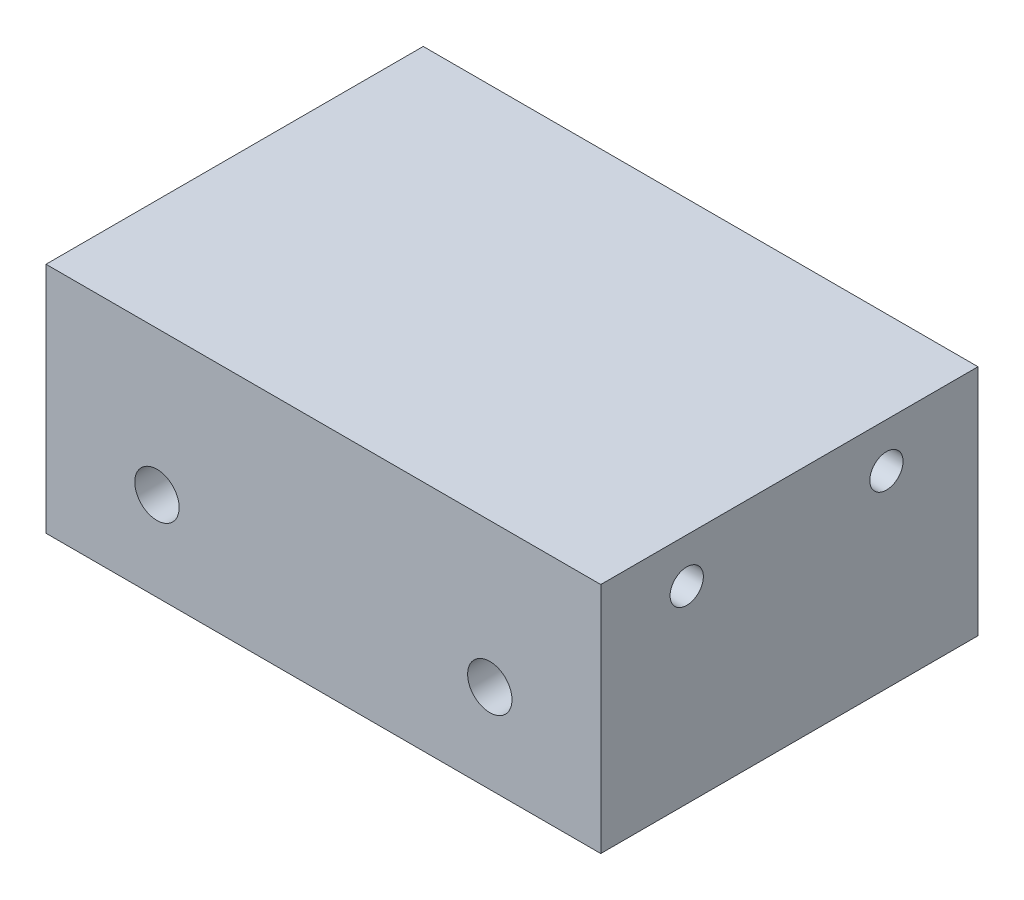
ISO-10303-21;
HEADER;
FILE_DESCRIPTION(('STEP AP214'),'2;1');
FILE_NAME('part.step','',(''),(''),'','','');
FILE_SCHEMA(('AUTOMOTIVE_DESIGN { 1 0 10303 214 1 1 1 1 }'));
ENDSEC;
DATA;
#1=APPLICATION_CONTEXT('core data for automotive mechanical design processes');
#2=APPLICATION_PROTOCOL_DEFINITION('international standard','automotive_design',2000,#1);
#3=PRODUCT_CONTEXT('',#1,'mechanical');
#4=PRODUCT('Part','Part','',(#3));
#5=PRODUCT_RELATED_PRODUCT_CATEGORY('part','',(#4));
#6=PRODUCT_DEFINITION_FORMATION('','',#4);
#7=PRODUCT_DEFINITION_CONTEXT('part definition',#1,'design');
#8=PRODUCT_DEFINITION('design','',#6,#7);
#9=PRODUCT_DEFINITION_SHAPE('','',#8);
#10=(LENGTH_UNIT() NAMED_UNIT(*) SI_UNIT(.MILLI.,.METRE.));
#11=(NAMED_UNIT(*) PLANE_ANGLE_UNIT() SI_UNIT($,.RADIAN.));
#12=(NAMED_UNIT(*) SI_UNIT($,.STERADIAN.) SOLID_ANGLE_UNIT());
#13=UNCERTAINTY_MEASURE_WITH_UNIT(LENGTH_MEASURE(1.E-05),#10,'distance_accuracy_value','');
#14=(GEOMETRIC_REPRESENTATION_CONTEXT(3) GLOBAL_UNCERTAINTY_ASSIGNED_CONTEXT((#13)) GLOBAL_UNIT_ASSIGNED_CONTEXT((#10,
#11,#12)) REPRESENTATION_CONTEXT('',''));
#15=CARTESIAN_POINT('',(0.,0.,0.));
#16=DIRECTION('',(0.,0.,1.));
#17=DIRECTION('',(1.,0.,0.));
#18=AXIS2_PLACEMENT_3D('',#15,#16,#17);
#19=CARTESIAN_POINT('',(-25.,-24.,88.230987451825));
#20=DIRECTION('',(-1.,0.,0.));
#21=DIRECTION('',(0.,-1.,0.));
#22=AXIS2_PLACEMENT_3D('',#19,#20,#21);
#23=PLANE('',#22);
#24=CARTESIAN_POINT('',(-25.,-7.,26.2525539123196));
#25=DIRECTION('',(-1.,0.,0.));
#26=DIRECTION('',(0.,-1.,0.));
#27=AXIS2_PLACEMENT_3D('',#24,#25,#26);
#28=CIRCLE('',#27,1.5);
#29=CARTESIAN_POINT('',(-25.,-8.5,26.2525539123196));
#30=VERTEX_POINT('',#29);
#31=EDGE_CURVE('E130',#30,#30,#28,.T.);
#32=ORIENTED_EDGE('',*,*,#31,.F.);
#33=EDGE_LOOP('',(#32));
#34=FACE_BOUND('',#33,.T.);
#35=CARTESIAN_POINT('',(-25.,-7.,8.25255391231962));
#36=DIRECTION('',(-1.,0.,0.));
#37=DIRECTION('',(0.,-1.,0.));
#38=AXIS2_PLACEMENT_3D('',#35,#36,#37);
#39=CIRCLE('',#38,1.5);
#40=CARTESIAN_POINT('',(-25.,-8.5,8.25255391231962));
#41=VERTEX_POINT('',#40);
#42=EDGE_CURVE('E124',#41,#41,#39,.T.);
#43=ORIENTED_EDGE('',*,*,#42,.F.);
#44=EDGE_LOOP('',(#43));
#45=FACE_BOUND('',#44,.T.);
#46=DIRECTION('',(0.,0.,-1.));
#47=VECTOR('',#46,1.);
#48=CARTESIAN_POINT('',(-25.,-24.,88.230987451825));
#49=LINE('',#48,#47);
#50=CARTESIAN_POINT('',(-25.,-24.,34.));
#51=VERTEX_POINT('',#50);
#52=CARTESIAN_POINT('',(-25.,-24.,0.));
#53=VERTEX_POINT('',#52);
#54=EDGE_CURVE('E92',#51,#53,#49,.T.);
#55=ORIENTED_EDGE('',*,*,#54,.F.);
#56=DIRECTION('',(0.,1.,0.));
#57=VECTOR('',#56,1.);
#58=CARTESIAN_POINT('',(-25.,-24.,34.));
#59=LINE('',#58,#57);
#60=CARTESIAN_POINT('',(-25.,-3.,34.));
#61=VERTEX_POINT('',#60);
#62=EDGE_CURVE('E106',#51,#61,#59,.T.);
#63=ORIENTED_EDGE('',*,*,#62,.T.);
#64=DIRECTION('',(0.,0.,-1.));
#65=VECTOR('',#64,1.);
#66=CARTESIAN_POINT('',(-25.,-3.,88.230987451825));
#67=LINE('',#66,#65);
#68=CARTESIAN_POINT('',(-25.,-3.,0.));
#69=VERTEX_POINT('',#68);
#70=EDGE_CURVE('E39',#61,#69,#67,.T.);
#71=ORIENTED_EDGE('',*,*,#70,.T.);
#72=DIRECTION('',(0.,1.,0.));
#73=VECTOR('',#72,1.);
#74=CARTESIAN_POINT('',(-25.,-24.,0.));
#75=LINE('',#74,#73);
#76=EDGE_CURVE('E102',#53,#69,#75,.T.);
#77=ORIENTED_EDGE('',*,*,#76,.F.);
#78=EDGE_LOOP('',(#55,#63,#71,#77));
#79=FACE_BOUND('',#78,.T.);
#80=ADVANCED_FACE('F35',(#34,#45,#79),#23,.T.);
#81=CARTESIAN_POINT('',(-25.,-24.,88.230987451825));
#82=DIRECTION('',(0.,1.,0.));
#83=DIRECTION('',(0.,0.,1.));
#84=AXIS2_PLACEMENT_3D('',#81,#82,#83);
#85=PLANE('',#84);
#86=DIRECTION('',(1.,0.,0.));
#87=VECTOR('',#86,1.);
#88=CARTESIAN_POINT('',(-25.,-24.,34.));
#89=LINE('',#88,#87);
#90=CARTESIAN_POINT('',(25.,-24.,34.));
#91=VERTEX_POINT('',#90);
#92=EDGE_CURVE('E74',#51,#91,#89,.T.);
#93=ORIENTED_EDGE('',*,*,#92,.F.);
#94=ORIENTED_EDGE('',*,*,#54,.T.);
#95=DIRECTION('',(1.,0.,0.));
#96=VECTOR('',#95,1.);
#97=CARTESIAN_POINT('',(-25.,-24.,0.));
#98=LINE('',#97,#96);
#99=CARTESIAN_POINT('',(25.,-24.,0.));
#100=VERTEX_POINT('',#99);
#101=EDGE_CURVE('E88',#53,#100,#98,.T.);
#102=ORIENTED_EDGE('',*,*,#101,.T.);
#103=DIRECTION('',(0.,0.,-1.));
#104=VECTOR('',#103,1.);
#105=CARTESIAN_POINT('',(25.,-24.,88.230987451825));
#106=LINE('',#105,#104);
#107=EDGE_CURVE('E82',#91,#100,#106,.T.);
#108=ORIENTED_EDGE('',*,*,#107,.F.);
#109=EDGE_LOOP('',(#93,#94,#102,#108));
#110=FACE_BOUND('',#109,.T.);
#111=ADVANCED_FACE('F91',(#110),#85,.F.);
#112=CARTESIAN_POINT('',(25.,-24.,88.230987451825));
#113=DIRECTION('',(-1.,0.,0.));
#114=DIRECTION('',(0.,-1.,0.));
#115=AXIS2_PLACEMENT_3D('',#112,#113,#114);
#116=PLANE('',#115);
#117=CARTESIAN_POINT('',(25.,-6.99999999999999,26.2525539123196));
#118=DIRECTION('',(-1.,0.,0.));
#119=DIRECTION('',(0.,-1.,0.));
#120=AXIS2_PLACEMENT_3D('',#117,#118,#119);
#121=CIRCLE('',#120,1.5);
#122=CARTESIAN_POINT('',(25.,-8.49999999999999,26.2525539123196));
#123=VERTEX_POINT('',#122);
#124=EDGE_CURVE('E127',#123,#123,#121,.T.);
#125=ORIENTED_EDGE('',*,*,#124,.T.);
#126=EDGE_LOOP('',(#125));
#127=FACE_BOUND('',#126,.T.);
#128=CARTESIAN_POINT('',(25.,-6.99999999999998,8.25255391231962));
#129=DIRECTION('',(-1.,0.,0.));
#130=DIRECTION('',(0.,-1.,0.));
#131=AXIS2_PLACEMENT_3D('',#128,#129,#130);
#132=CIRCLE('',#131,1.5);
#133=CARTESIAN_POINT('',(25.,-8.49999999999998,8.25255391231962));
#134=VERTEX_POINT('',#133);
#135=EDGE_CURVE('E121',#134,#134,#132,.T.);
#136=ORIENTED_EDGE('',*,*,#135,.T.);
#137=EDGE_LOOP('',(#136));
#138=FACE_BOUND('',#137,.T.);
#139=DIRECTION('',(0.,1.,0.));
#140=VECTOR('',#139,1.);
#141=CARTESIAN_POINT('',(25.,-24.,34.));
#142=LINE('',#141,#140);
#143=CARTESIAN_POINT('',(25.,-3.,34.));
#144=VERTEX_POINT('',#143);
#145=EDGE_CURVE('E44',#91,#144,#142,.T.);
#146=ORIENTED_EDGE('',*,*,#145,.F.);
#147=ORIENTED_EDGE('',*,*,#107,.T.);
#148=DIRECTION('',(0.,1.,0.));
#149=VECTOR('',#148,1.);
#150=CARTESIAN_POINT('',(25.,-24.,0.));
#151=LINE('',#150,#149);
#152=CARTESIAN_POINT('',(25.,-3.,0.));
#153=VERTEX_POINT('',#152);
#154=EDGE_CURVE('E86',#100,#153,#151,.T.);
#155=ORIENTED_EDGE('',*,*,#154,.T.);
#156=DIRECTION('',(0.,0.,-1.));
#157=VECTOR('',#156,1.);
#158=CARTESIAN_POINT('',(25.,-3.,88.230987451825));
#159=LINE('',#158,#157);
#160=EDGE_CURVE('E57',#144,#153,#159,.T.);
#161=ORIENTED_EDGE('',*,*,#160,.F.);
#162=EDGE_LOOP('',(#146,#147,#155,#161));
#163=FACE_BOUND('',#162,.T.);
#164=ADVANCED_FACE('F84',(#127,#138,#163),#116,.F.);
#165=CARTESIAN_POINT('',(25.,-3.,88.230987451825));
#166=DIRECTION('',(0.,-1.,0.));
#167=DIRECTION('',(0.,0.,-1.));
#168=AXIS2_PLACEMENT_3D('',#165,#166,#167);
#169=PLANE('',#168);
#170=DIRECTION('',(-1.,0.,0.));
#171=VECTOR('',#170,1.);
#172=CARTESIAN_POINT('',(25.,-3.,34.));
#173=LINE('',#172,#171);
#174=EDGE_CURVE('E11',#144,#61,#173,.T.);
#175=ORIENTED_EDGE('',*,*,#174,.F.);
#176=ORIENTED_EDGE('',*,*,#160,.T.);
#177=DIRECTION('',(-1.,0.,0.));
#178=VECTOR('',#177,1.);
#179=CARTESIAN_POINT('',(25.,-3.,0.));
#180=LINE('',#179,#178);
#181=EDGE_CURVE('E97',#153,#69,#180,.T.);
#182=ORIENTED_EDGE('',*,*,#181,.T.);
#183=ORIENTED_EDGE('',*,*,#70,.F.);
#184=EDGE_LOOP('',(#175,#176,#182,#183));
#185=FACE_BOUND('',#184,.T.);
#186=ADVANCED_FACE('F149',(#185),#169,.F.);
#187=CARTESIAN_POINT('',(0.,0.,0.));
#188=DIRECTION('',(0.,0.,1.));
#189=DIRECTION('',(1.,0.,0.));
#190=AXIS2_PLACEMENT_3D('',#187,#188,#189);
#191=PLANE('',#190);
#192=CARTESIAN_POINT('',(-15.,-16.,0.));
#193=DIRECTION('',(0.,0.,-1.));
#194=DIRECTION('',(-1.,0.,0.));
#195=AXIS2_PLACEMENT_3D('',#192,#193,#194);
#196=CIRCLE('',#195,2.00000000000001);
#197=CARTESIAN_POINT('',(-17.,-16.,0.));
#198=VERTEX_POINT('',#197);
#199=EDGE_CURVE('E118',#198,#198,#196,.T.);
#200=ORIENTED_EDGE('',*,*,#199,.F.);
#201=EDGE_LOOP('',(#200));
#202=FACE_BOUND('',#201,.T.);
#203=CARTESIAN_POINT('',(15.,-16.,0.));
#204=DIRECTION('',(0.,0.,-1.));
#205=DIRECTION('',(-1.,0.,0.));
#206=AXIS2_PLACEMENT_3D('',#203,#204,#205);
#207=CIRCLE('',#206,2.00000000000002);
#208=CARTESIAN_POINT('',(13.,-16.,0.));
#209=VERTEX_POINT('',#208);
#210=EDGE_CURVE('E111',#209,#209,#207,.T.);
#211=ORIENTED_EDGE('',*,*,#210,.F.);
#212=EDGE_LOOP('',(#211));
#213=FACE_BOUND('',#212,.T.);
#214=ORIENTED_EDGE('',*,*,#76,.T.);
#215=ORIENTED_EDGE('',*,*,#181,.F.);
#216=ORIENTED_EDGE('',*,*,#154,.F.);
#217=ORIENTED_EDGE('',*,*,#101,.F.);
#218=EDGE_LOOP('',(#214,#215,#216,#217));
#219=FACE_BOUND('',#218,.T.);
#220=ADVANCED_FACE('F96',(#202,#213,#219),#191,.F.);
#221=CARTESIAN_POINT('',(-25.,-24.,34.));
#222=DIRECTION('',(0.,0.,1.));
#223=DIRECTION('',(0.,-1.,0.));
#224=AXIS2_PLACEMENT_3D('',#221,#222,#223);
#225=PLANE('',#224);
#226=CARTESIAN_POINT('',(-15.,-16.,34.));
#227=DIRECTION('',(0.,0.,-1.));
#228=DIRECTION('',(-1.,0.,0.));
#229=AXIS2_PLACEMENT_3D('',#226,#227,#228);
#230=CIRCLE('',#229,2.00000000000001);
#231=CARTESIAN_POINT('',(-17.,-16.,34.));
#232=VERTEX_POINT('',#231);
#233=EDGE_CURVE('E116',#232,#232,#230,.T.);
#234=ORIENTED_EDGE('',*,*,#233,.T.);
#235=EDGE_LOOP('',(#234));
#236=FACE_BOUND('',#235,.T.);
#237=CARTESIAN_POINT('',(15.,-16.,34.));
#238=DIRECTION('',(0.,0.,-1.));
#239=DIRECTION('',(-1.,0.,0.));
#240=AXIS2_PLACEMENT_3D('',#237,#238,#239);
#241=CIRCLE('',#240,2.00000000000002);
#242=CARTESIAN_POINT('',(13.,-16.,34.));
#243=VERTEX_POINT('',#242);
#244=EDGE_CURVE('E107',#243,#243,#241,.T.);
#245=ORIENTED_EDGE('',*,*,#244,.T.);
#246=EDGE_LOOP('',(#245));
#247=FACE_BOUND('',#246,.T.);
#248=ORIENTED_EDGE('',*,*,#62,.F.);
#249=ORIENTED_EDGE('',*,*,#92,.T.);
#250=ORIENTED_EDGE('',*,*,#145,.T.);
#251=ORIENTED_EDGE('',*,*,#174,.T.);
#252=EDGE_LOOP('',(#248,#249,#250,#251));
#253=FACE_BOUND('',#252,.T.);
#254=ADVANCED_FACE('F37',(#236,#247,#253),#225,.T.);
#255=CARTESIAN_POINT('',(15.,-16.,34.));
#256=DIRECTION('',(0.,0.,-1.));
#257=DIRECTION('',(-1.,0.,0.));
#258=AXIS2_PLACEMENT_3D('',#255,#256,#257);
#259=CYLINDRICAL_SURFACE('',#258,2.00000000000002);
#260=ORIENTED_EDGE('',*,*,#244,.F.);
#261=EDGE_LOOP('',(#260));
#262=FACE_BOUND('',#261,.T.);
#263=ORIENTED_EDGE('',*,*,#210,.T.);
#264=EDGE_LOOP('',(#263));
#265=FACE_BOUND('',#264,.T.);
#266=ADVANCED_FACE('F198',(#262,#265),#259,.F.);
#267=CARTESIAN_POINT('',(-15.,-16.,34.));
#268=DIRECTION('',(0.,0.,-1.));
#269=DIRECTION('',(-1.,0.,0.));
#270=AXIS2_PLACEMENT_3D('',#267,#268,#269);
#271=CYLINDRICAL_SURFACE('',#270,2.00000000000001);
#272=ORIENTED_EDGE('',*,*,#233,.F.);
#273=EDGE_LOOP('',(#272));
#274=FACE_BOUND('',#273,.T.);
#275=ORIENTED_EDGE('',*,*,#199,.T.);
#276=EDGE_LOOP('',(#275));
#277=FACE_BOUND('',#276,.T.);
#278=ADVANCED_FACE('F183',(#274,#277),#271,.F.);
#279=CARTESIAN_POINT('',(25.,-6.99999999999998,8.25255391231962));
#280=DIRECTION('',(-1.,0.,0.));
#281=DIRECTION('',(0.,-1.,0.));
#282=AXIS2_PLACEMENT_3D('',#279,#280,#281);
#283=CYLINDRICAL_SURFACE('',#282,1.5);
#284=ORIENTED_EDGE('',*,*,#135,.F.);
#285=EDGE_LOOP('',(#284));
#286=FACE_BOUND('',#285,.T.);
#287=ORIENTED_EDGE('',*,*,#42,.T.);
#288=EDGE_LOOP('',(#287));
#289=FACE_BOUND('',#288,.T.);
#290=ADVANCED_FACE('F141',(#286,#289),#283,.F.);
#291=CARTESIAN_POINT('',(25.,-6.99999999999999,26.2525539123196));
#292=DIRECTION('',(-1.,0.,0.));
#293=DIRECTION('',(0.,-1.,0.));
#294=AXIS2_PLACEMENT_3D('',#291,#292,#293);
#295=CYLINDRICAL_SURFACE('',#294,1.5);
#296=ORIENTED_EDGE('',*,*,#124,.F.);
#297=EDGE_LOOP('',(#296));
#298=FACE_BOUND('',#297,.T.);
#299=ORIENTED_EDGE('',*,*,#31,.T.);
#300=EDGE_LOOP('',(#299));
#301=FACE_BOUND('',#300,.T.);
#302=ADVANCED_FACE('F138',(#298,#301),#295,.F.);
#303=CLOSED_SHELL('',(#80,#111,#164,#186,#220,#254,#266,#278,#290,#302));
#304=MANIFOLD_SOLID_BREP('B2',#303);
#305=ADVANCED_BREP_SHAPE_REPRESENTATION('',(#18,#304),#14);
#306=SHAPE_DEFINITION_REPRESENTATION(#9,#305);
ENDSEC;
END-ISO-10303-21;
